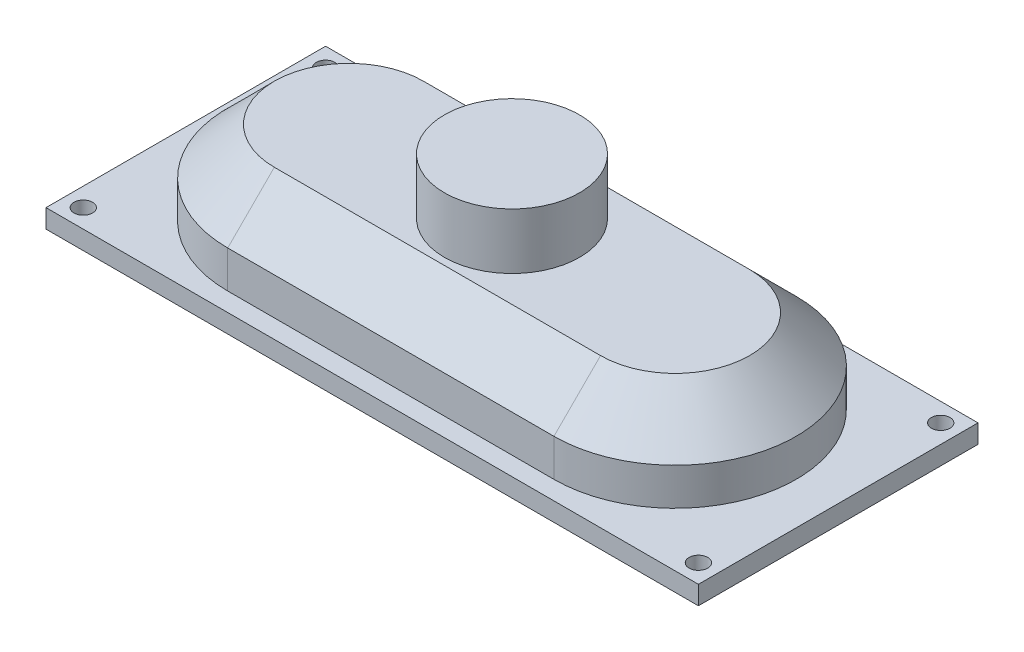
ISO-10303-21;
HEADER;
FILE_DESCRIPTION(('STEP AP214'),'2;1');
FILE_NAME('part.step','',(''),(''),'','','');
FILE_SCHEMA(('AUTOMOTIVE_DESIGN { 1 0 10303 214 1 1 1 1 }'));
ENDSEC;
DATA;
#1=APPLICATION_CONTEXT('core data for automotive mechanical design processes');
#2=APPLICATION_PROTOCOL_DEFINITION('international standard','automotive_design',2000,#1);
#3=PRODUCT_CONTEXT('',#1,'mechanical');
#4=PRODUCT('Part','Part','',(#3));
#5=PRODUCT_RELATED_PRODUCT_CATEGORY('part','',(#4));
#6=PRODUCT_DEFINITION_FORMATION('','',#4);
#7=PRODUCT_DEFINITION_CONTEXT('part definition',#1,'design');
#8=PRODUCT_DEFINITION('design','',#6,#7);
#9=PRODUCT_DEFINITION_SHAPE('','',#8);
#10=(LENGTH_UNIT() NAMED_UNIT(*) SI_UNIT(.MILLI.,.METRE.));
#11=(NAMED_UNIT(*) PLANE_ANGLE_UNIT() SI_UNIT($,.RADIAN.));
#12=(NAMED_UNIT(*) SI_UNIT($,.STERADIAN.) SOLID_ANGLE_UNIT());
#13=UNCERTAINTY_MEASURE_WITH_UNIT(LENGTH_MEASURE(1.E-05),#10,'distance_accuracy_value','');
#14=(GEOMETRIC_REPRESENTATION_CONTEXT(3) GLOBAL_UNCERTAINTY_ASSIGNED_CONTEXT((#13)) GLOBAL_UNIT_ASSIGNED_CONTEXT((#10,
#11,#12)) REPRESENTATION_CONTEXT('',''));
#15=CARTESIAN_POINT('',(0.,0.,0.));
#16=DIRECTION('',(0.,0.,1.));
#17=DIRECTION('',(1.,0.,0.));
#18=AXIS2_PLACEMENT_3D('',#15,#16,#17);
#19=CARTESIAN_POINT('',(0.,2.,0.));
#20=DIRECTION('',(0.,1.,0.));
#21=DIRECTION('',(0.,0.,1.));
#22=AXIS2_PLACEMENT_3D('',#19,#20,#21);
#23=PLANE('',#22);
#24=CARTESIAN_POINT('',(33.,2.,-13.));
#25=DIRECTION('',(0.,1.,0.));
#26=DIRECTION('',(0.,0.,-1.));
#27=AXIS2_PLACEMENT_3D('',#24,#25,#26);
#28=CIRCLE('',#27,0.999999999999998);
#29=CARTESIAN_POINT('',(33.,2.,-14.));
#30=VERTEX_POINT('',#29);
#31=EDGE_CURVE('E334',#30,#30,#28,.T.);
#32=ORIENTED_EDGE('',*,*,#31,.F.);
#33=EDGE_LOOP('',(#32));
#34=FACE_BOUND('',#33,.T.);
#35=CARTESIAN_POINT('',(33.,2.,13.));
#36=DIRECTION('',(0.,1.,0.));
#37=DIRECTION('',(0.,0.,1.));
#38=AXIS2_PLACEMENT_3D('',#35,#36,#37);
#39=CIRCLE('',#38,0.999999999999998);
#40=CARTESIAN_POINT('',(33.,2.,14.));
#41=VERTEX_POINT('',#40);
#42=EDGE_CURVE('E340',#41,#41,#39,.T.);
#43=ORIENTED_EDGE('',*,*,#42,.F.);
#44=EDGE_LOOP('',(#43));
#45=FACE_BOUND('',#44,.T.);
#46=CARTESIAN_POINT('',(-33.,2.,13.));
#47=DIRECTION('',(0.,1.,0.));
#48=DIRECTION('',(0.,0.,-1.));
#49=AXIS2_PLACEMENT_3D('',#46,#47,#48);
#50=CIRCLE('',#49,0.999999999999998);
#51=CARTESIAN_POINT('',(-33.,2.,12.));
#52=VERTEX_POINT('',#51);
#53=EDGE_CURVE('E329',#52,#52,#50,.T.);
#54=ORIENTED_EDGE('',*,*,#53,.F.);
#55=EDGE_LOOP('',(#54));
#56=FACE_BOUND('',#55,.T.);
#57=CARTESIAN_POINT('',(-33.,2.,-13.));
#58=DIRECTION('',(0.,1.,0.));
#59=DIRECTION('',(0.,0.,1.));
#60=AXIS2_PLACEMENT_3D('',#57,#58,#59);
#61=CIRCLE('',#60,0.999999999999998);
#62=CARTESIAN_POINT('',(-33.,2.,-12.));
#63=VERTEX_POINT('',#62);
#64=EDGE_CURVE('E333',#63,#63,#61,.T.);
#65=ORIENTED_EDGE('',*,*,#64,.F.);
#66=EDGE_LOOP('',(#65));
#67=FACE_BOUND('',#66,.T.);
#68=DIRECTION('',(0.,0.,1.));
#69=VECTOR('',#68,1.);
#70=CARTESIAN_POINT('',(-35.,2.,-15.));
#71=LINE('',#70,#69);
#72=CARTESIAN_POINT('',(-35.,2.,-15.));
#73=VERTEX_POINT('',#72);
#74=CARTESIAN_POINT('',(-35.,2.,15.));
#75=VERTEX_POINT('',#74);
#76=EDGE_CURVE('E354',#73,#75,#71,.T.);
#77=ORIENTED_EDGE('',*,*,#76,.T.);
#78=DIRECTION('',(1.,0.,0.));
#79=VECTOR('',#78,1.);
#80=CARTESIAN_POINT('',(-35.,2.,15.));
#81=LINE('',#80,#79);
#82=CARTESIAN_POINT('',(35.,2.,15.));
#83=VERTEX_POINT('',#82);
#84=EDGE_CURVE('E357',#75,#83,#81,.T.);
#85=ORIENTED_EDGE('',*,*,#84,.T.);
#86=DIRECTION('',(0.,0.,-1.));
#87=VECTOR('',#86,1.);
#88=CARTESIAN_POINT('',(35.,2.,-15.));
#89=LINE('',#88,#87);
#90=CARTESIAN_POINT('',(35.,2.,-15.));
#91=VERTEX_POINT('',#90);
#92=EDGE_CURVE('E360',#83,#91,#89,.T.);
#93=ORIENTED_EDGE('',*,*,#92,.T.);
#94=DIRECTION('',(-1.,0.,0.));
#95=VECTOR('',#94,1.);
#96=CARTESIAN_POINT('',(-35.,2.,-15.));
#97=LINE('',#96,#95);
#98=EDGE_CURVE('E362',#91,#73,#97,.T.);
#99=ORIENTED_EDGE('',*,*,#98,.T.);
#100=EDGE_LOOP('',(#77,#85,#93,#99));
#101=FACE_BOUND('',#100,.T.);
#102=DIRECTION('',(1.,0.,0.));
#103=VECTOR('',#102,1.);
#104=CARTESIAN_POINT('',(-17.5,2.,13.));
#105=LINE('',#104,#103);
#106=CARTESIAN_POINT('',(-17.5,2.,13.));
#107=VERTEX_POINT('',#106);
#108=CARTESIAN_POINT('',(17.5,2.,13.));
#109=VERTEX_POINT('',#108);
#110=EDGE_CURVE('E312',#107,#109,#105,.T.);
#111=ORIENTED_EDGE('',*,*,#110,.F.);
#112=CARTESIAN_POINT('',(-17.5,2.,0.));
#113=DIRECTION('',(0.,1.,0.));
#114=DIRECTION('',(0.,0.,1.));
#115=AXIS2_PLACEMENT_3D('',#112,#113,#114);
#116=CIRCLE('',#115,13.);
#117=CARTESIAN_POINT('',(-17.5,2.,-13.));
#118=VERTEX_POINT('',#117);
#119=EDGE_CURVE('E309',#118,#107,#116,.T.);
#120=ORIENTED_EDGE('',*,*,#119,.F.);
#121=DIRECTION('',(-1.,0.,0.));
#122=VECTOR('',#121,1.);
#123=CARTESIAN_POINT('',(-17.5,2.,-13.));
#124=LINE('',#123,#122);
#125=CARTESIAN_POINT('',(17.5,2.,-13.));
#126=VERTEX_POINT('',#125);
#127=EDGE_CURVE('E318',#126,#118,#124,.T.);
#128=ORIENTED_EDGE('',*,*,#127,.F.);
#129=CARTESIAN_POINT('',(17.5,2.,0.));
#130=DIRECTION('',(0.,1.,0.));
#131=DIRECTION('',(0.,0.,1.));
#132=AXIS2_PLACEMENT_3D('',#129,#130,#131);
#133=CIRCLE('',#132,13.);
#134=EDGE_CURVE('E315',#109,#126,#133,.T.);
#135=ORIENTED_EDGE('',*,*,#134,.F.);
#136=EDGE_LOOP('',(#111,#120,#128,#135));
#137=FACE_BOUND('',#136,.T.);
#138=ADVANCED_FACE('F37',(#34,#45,#56,#67,#101,#137),#23,.T.);
#139=CARTESIAN_POINT('',(-35.,2.,-15.));
#140=DIRECTION('',(1.,0.,0.));
#141=DIRECTION('',(0.,0.,-1.));
#142=AXIS2_PLACEMENT_3D('',#139,#140,#141);
#143=PLANE('',#142);
#144=DIRECTION('',(0.,0.,1.));
#145=VECTOR('',#144,1.);
#146=CARTESIAN_POINT('',(-35.,0.,-15.));
#147=LINE('',#146,#145);
#148=CARTESIAN_POINT('',(-35.,0.,-15.));
#149=VERTEX_POINT('',#148);
#150=CARTESIAN_POINT('',(-35.,0.,15.));
#151=VERTEX_POINT('',#150);
#152=EDGE_CURVE('E351',#149,#151,#147,.T.);
#153=ORIENTED_EDGE('',*,*,#152,.T.);
#154=DIRECTION('',(0.,-1.,0.));
#155=VECTOR('',#154,1.);
#156=CARTESIAN_POINT('',(-35.,2.,15.));
#157=LINE('',#156,#155);
#158=EDGE_CURVE('E380',#75,#151,#157,.T.);
#159=ORIENTED_EDGE('',*,*,#158,.F.);
#160=ORIENTED_EDGE('',*,*,#76,.F.);
#161=DIRECTION('',(0.,-1.,0.));
#162=VECTOR('',#161,1.);
#163=CARTESIAN_POINT('',(-35.,2.,-15.));
#164=LINE('',#163,#162);
#165=EDGE_CURVE('E364',#73,#149,#164,.T.);
#166=ORIENTED_EDGE('',*,*,#165,.T.);
#167=EDGE_LOOP('',(#153,#159,#160,#166));
#168=FACE_BOUND('',#167,.T.);
#169=ADVANCED_FACE('F448',(#168),#143,.F.);
#170=CARTESIAN_POINT('',(-35.,2.,15.));
#171=DIRECTION('',(0.,0.,-1.));
#172=DIRECTION('',(-1.,0.,0.));
#173=AXIS2_PLACEMENT_3D('',#170,#171,#172);
#174=PLANE('',#173);
#175=DIRECTION('',(1.,0.,0.));
#176=VECTOR('',#175,1.);
#177=CARTESIAN_POINT('',(-35.,0.,15.));
#178=LINE('',#177,#176);
#179=CARTESIAN_POINT('',(35.,0.,15.));
#180=VERTEX_POINT('',#179);
#181=EDGE_CURVE('E367',#151,#180,#178,.T.);
#182=ORIENTED_EDGE('',*,*,#181,.T.);
#183=DIRECTION('',(0.,-1.,0.));
#184=VECTOR('',#183,1.);
#185=CARTESIAN_POINT('',(35.,2.,15.));
#186=LINE('',#185,#184);
#187=EDGE_CURVE('E377',#83,#180,#186,.T.);
#188=ORIENTED_EDGE('',*,*,#187,.F.);
#189=ORIENTED_EDGE('',*,*,#84,.F.);
#190=ORIENTED_EDGE('',*,*,#158,.T.);
#191=EDGE_LOOP('',(#182,#188,#189,#190));
#192=FACE_BOUND('',#191,.T.);
#193=ADVANCED_FACE('F454',(#192),#174,.F.);
#194=CARTESIAN_POINT('',(35.,2.,-15.));
#195=DIRECTION('',(-1.,0.,0.));
#196=DIRECTION('',(0.,0.,1.));
#197=AXIS2_PLACEMENT_3D('',#194,#195,#196);
#198=PLANE('',#197);
#199=DIRECTION('',(0.,0.,-1.));
#200=VECTOR('',#199,1.);
#201=CARTESIAN_POINT('',(35.,0.,-15.));
#202=LINE('',#201,#200);
#203=CARTESIAN_POINT('',(35.,0.,-15.));
#204=VERTEX_POINT('',#203);
#205=EDGE_CURVE('E369',#180,#204,#202,.T.);
#206=ORIENTED_EDGE('',*,*,#205,.T.);
#207=DIRECTION('',(0.,-1.,0.));
#208=VECTOR('',#207,1.);
#209=CARTESIAN_POINT('',(35.,2.,-15.));
#210=LINE('',#209,#208);
#211=EDGE_CURVE('E374',#91,#204,#210,.T.);
#212=ORIENTED_EDGE('',*,*,#211,.F.);
#213=ORIENTED_EDGE('',*,*,#92,.F.);
#214=ORIENTED_EDGE('',*,*,#187,.T.);
#215=EDGE_LOOP('',(#206,#212,#213,#214));
#216=FACE_BOUND('',#215,.T.);
#217=ADVANCED_FACE('F470',(#216),#198,.F.);
#218=CARTESIAN_POINT('',(-35.,2.,-15.));
#219=DIRECTION('',(0.,0.,1.));
#220=DIRECTION('',(1.,0.,0.));
#221=AXIS2_PLACEMENT_3D('',#218,#219,#220);
#222=PLANE('',#221);
#223=DIRECTION('',(-1.,0.,0.));
#224=VECTOR('',#223,1.);
#225=CARTESIAN_POINT('',(-35.,0.,-15.));
#226=LINE('',#225,#224);
#227=EDGE_CURVE('E358',#204,#149,#226,.T.);
#228=ORIENTED_EDGE('',*,*,#227,.T.);
#229=ORIENTED_EDGE('',*,*,#165,.F.);
#230=ORIENTED_EDGE('',*,*,#98,.F.);
#231=ORIENTED_EDGE('',*,*,#211,.T.);
#232=EDGE_LOOP('',(#228,#229,#230,#231));
#233=FACE_BOUND('',#232,.T.);
#234=ADVANCED_FACE('F466',(#233),#222,.F.);
#235=CARTESIAN_POINT('',(0.,0.,0.));
#236=DIRECTION('',(0.,1.,0.));
#237=DIRECTION('',(0.,0.,1.));
#238=AXIS2_PLACEMENT_3D('',#235,#236,#237);
#239=PLANE('',#238);
#240=CARTESIAN_POINT('',(-33.,0.,-13.));
#241=DIRECTION('',(0.,1.,0.));
#242=DIRECTION('',(0.,0.,1.));
#243=AXIS2_PLACEMENT_3D('',#240,#241,#242);
#244=CIRCLE('',#243,2.);
#245=CARTESIAN_POINT('',(-34.,0.,-11.2679491924311));
#246=VERTEX_POINT('',#245);
#247=CARTESIAN_POINT('',(-31.2679491924311,0.,-14.));
#248=VERTEX_POINT('',#247);
#249=EDGE_CURVE('E270',#246,#248,#244,.T.);
#250=ORIENTED_EDGE('',*,*,#249,.F.);
#251=DIRECTION('',(0.,0.,1.));
#252=VECTOR('',#251,1.);
#253=CARTESIAN_POINT('',(-34.,0.,-15.));
#254=LINE('',#253,#252);
#255=CARTESIAN_POINT('',(-34.,0.,11.2679491924311));
#256=VERTEX_POINT('',#255);
#257=EDGE_CURVE('E267',#246,#256,#254,.T.);
#258=ORIENTED_EDGE('',*,*,#257,.T.);
#259=CARTESIAN_POINT('',(-33.,0.,13.));
#260=DIRECTION('',(0.,1.,0.));
#261=DIRECTION('',(0.,0.,1.));
#262=AXIS2_PLACEMENT_3D('',#259,#260,#261);
#263=CIRCLE('',#262,2.);
#264=CARTESIAN_POINT('',(-31.2679491924311,0.,14.));
#265=VERTEX_POINT('',#264);
#266=EDGE_CURVE('E282',#265,#256,#263,.T.);
#267=ORIENTED_EDGE('',*,*,#266,.F.);
#268=DIRECTION('',(1.,0.,0.));
#269=VECTOR('',#268,1.);
#270=CARTESIAN_POINT('',(-35.,0.,14.));
#271=LINE('',#270,#269);
#272=CARTESIAN_POINT('',(31.2679491924311,0.,14.));
#273=VERTEX_POINT('',#272);
#274=EDGE_CURVE('E54',#265,#273,#271,.T.);
#275=ORIENTED_EDGE('',*,*,#274,.T.);
#276=CARTESIAN_POINT('',(33.,0.,13.));
#277=DIRECTION('',(0.,1.,0.));
#278=DIRECTION('',(0.,0.,1.));
#279=AXIS2_PLACEMENT_3D('',#276,#277,#278);
#280=CIRCLE('',#279,2.);
#281=CARTESIAN_POINT('',(34.,0.,11.2679491924311));
#282=VERTEX_POINT('',#281);
#283=EDGE_CURVE('E286',#282,#273,#280,.T.);
#284=ORIENTED_EDGE('',*,*,#283,.F.);
#285=DIRECTION('',(0.,0.,-1.));
#286=VECTOR('',#285,1.);
#287=CARTESIAN_POINT('',(34.,0.,-15.));
#288=LINE('',#287,#286);
#289=CARTESIAN_POINT('',(34.,0.,-11.2679491924311));
#290=VERTEX_POINT('',#289);
#291=EDGE_CURVE('E275',#282,#290,#288,.T.);
#292=ORIENTED_EDGE('',*,*,#291,.T.);
#293=CARTESIAN_POINT('',(33.,0.,-13.));
#294=DIRECTION('',(0.,1.,0.));
#295=DIRECTION('',(0.,0.,1.));
#296=AXIS2_PLACEMENT_3D('',#293,#294,#295);
#297=CIRCLE('',#296,2.);
#298=CARTESIAN_POINT('',(31.2679491924311,0.,-14.));
#299=VERTEX_POINT('',#298);
#300=EDGE_CURVE('E290',#299,#290,#297,.T.);
#301=ORIENTED_EDGE('',*,*,#300,.F.);
#302=DIRECTION('',(-1.,0.,0.));
#303=VECTOR('',#302,1.);
#304=CARTESIAN_POINT('',(-35.,0.,-14.));
#305=LINE('',#304,#303);
#306=EDGE_CURVE('E271',#299,#248,#305,.T.);
#307=ORIENTED_EDGE('',*,*,#306,.T.);
#308=EDGE_LOOP('',(#250,#258,#267,#275,#284,#292,#301,#307));
#309=FACE_BOUND('',#308,.T.);
#310=CARTESIAN_POINT('',(33.,0.,-13.));
#311=DIRECTION('',(0.,1.,0.));
#312=DIRECTION('',(0.,0.,-1.));
#313=AXIS2_PLACEMENT_3D('',#310,#311,#312);
#314=CIRCLE('',#313,0.999999999999998);
#315=CARTESIAN_POINT('',(33.,0.,-14.));
#316=VERTEX_POINT('',#315);
#317=EDGE_CURVE('E330',#316,#316,#314,.T.);
#318=ORIENTED_EDGE('',*,*,#317,.T.);
#319=EDGE_LOOP('',(#318));
#320=FACE_BOUND('',#319,.T.);
#321=CARTESIAN_POINT('',(33.,0.,13.));
#322=DIRECTION('',(0.,1.,0.));
#323=DIRECTION('',(0.,0.,1.));
#324=AXIS2_PLACEMENT_3D('',#321,#322,#323);
#325=CIRCLE('',#324,0.999999999999998);
#326=CARTESIAN_POINT('',(33.,0.,14.));
#327=VERTEX_POINT('',#326);
#328=EDGE_CURVE('E337',#327,#327,#325,.T.);
#329=ORIENTED_EDGE('',*,*,#328,.T.);
#330=EDGE_LOOP('',(#329));
#331=FACE_BOUND('',#330,.T.);
#332=CARTESIAN_POINT('',(-33.,0.,13.));
#333=DIRECTION('',(0.,1.,0.));
#334=DIRECTION('',(0.,0.,-1.));
#335=AXIS2_PLACEMENT_3D('',#332,#333,#334);
#336=CIRCLE('',#335,0.999999999999998);
#337=CARTESIAN_POINT('',(-33.,0.,12.));
#338=VERTEX_POINT('',#337);
#339=EDGE_CURVE('E343',#338,#338,#336,.T.);
#340=ORIENTED_EDGE('',*,*,#339,.T.);
#341=EDGE_LOOP('',(#340));
#342=FACE_BOUND('',#341,.T.);
#343=CARTESIAN_POINT('',(-33.,0.,-13.));
#344=DIRECTION('',(0.,1.,0.));
#345=DIRECTION('',(0.,0.,1.));
#346=AXIS2_PLACEMENT_3D('',#343,#344,#345);
#347=CIRCLE('',#346,0.999999999999998);
#348=CARTESIAN_POINT('',(-33.,0.,-12.));
#349=VERTEX_POINT('',#348);
#350=EDGE_CURVE('E348',#349,#349,#347,.T.);
#351=ORIENTED_EDGE('',*,*,#350,.T.);
#352=EDGE_LOOP('',(#351));
#353=FACE_BOUND('',#352,.T.);
#354=ORIENTED_EDGE('',*,*,#152,.F.);
#355=ORIENTED_EDGE('',*,*,#227,.F.);
#356=ORIENTED_EDGE('',*,*,#205,.F.);
#357=ORIENTED_EDGE('',*,*,#181,.F.);
#358=EDGE_LOOP('',(#354,#355,#356,#357));
#359=FACE_BOUND('',#358,.T.);
#360=ADVANCED_FACE('F463',(#309,#320,#331,#342,#353,#359),#239,.F.);
#361=CARTESIAN_POINT('',(-33.,0.,-13.));
#362=DIRECTION('',(0.,1.,0.));
#363=DIRECTION('',(0.,0.,1.));
#364=AXIS2_PLACEMENT_3D('',#361,#362,#363);
#365=CYLINDRICAL_SURFACE('',#364,0.999999999999998);
#366=ORIENTED_EDGE('',*,*,#350,.F.);
#367=EDGE_LOOP('',(#366));
#368=FACE_BOUND('',#367,.T.);
#369=ORIENTED_EDGE('',*,*,#64,.T.);
#370=EDGE_LOOP('',(#369));
#371=FACE_BOUND('',#370,.T.);
#372=ADVANCED_FACE('F461',(#368,#371),#365,.F.);
#373=CARTESIAN_POINT('',(-33.,0.,13.));
#374=DIRECTION('',(0.,1.,0.));
#375=DIRECTION('',(0.,0.,1.));
#376=AXIS2_PLACEMENT_3D('',#373,#374,#375);
#377=CYLINDRICAL_SURFACE('',#376,0.999999999999998);
#378=ORIENTED_EDGE('',*,*,#339,.F.);
#379=EDGE_LOOP('',(#378));
#380=FACE_BOUND('',#379,.T.);
#381=ORIENTED_EDGE('',*,*,#53,.T.);
#382=EDGE_LOOP('',(#381));
#383=FACE_BOUND('',#382,.T.);
#384=ADVANCED_FACE('F750',(#380,#383),#377,.F.);
#385=CARTESIAN_POINT('',(33.,0.,13.));
#386=DIRECTION('',(0.,1.,0.));
#387=DIRECTION('',(0.,0.,1.));
#388=AXIS2_PLACEMENT_3D('',#385,#386,#387);
#389=CYLINDRICAL_SURFACE('',#388,0.999999999999998);
#390=ORIENTED_EDGE('',*,*,#328,.F.);
#391=EDGE_LOOP('',(#390));
#392=FACE_BOUND('',#391,.T.);
#393=ORIENTED_EDGE('',*,*,#42,.T.);
#394=EDGE_LOOP('',(#393));
#395=FACE_BOUND('',#394,.T.);
#396=ADVANCED_FACE('F741',(#392,#395),#389,.F.);
#397=CARTESIAN_POINT('',(33.,0.,-13.));
#398=DIRECTION('',(0.,1.,0.));
#399=DIRECTION('',(0.,0.,1.));
#400=AXIS2_PLACEMENT_3D('',#397,#398,#399);
#401=CYLINDRICAL_SURFACE('',#400,0.999999999999998);
#402=ORIENTED_EDGE('',*,*,#317,.F.);
#403=EDGE_LOOP('',(#402));
#404=FACE_BOUND('',#403,.T.);
#405=ORIENTED_EDGE('',*,*,#31,.T.);
#406=EDGE_LOOP('',(#405));
#407=FACE_BOUND('',#406,.T.);
#408=ADVANCED_FACE('F729',(#404,#407),#401,.F.);
#409=CARTESIAN_POINT('',(-17.5,11.,0.));
#410=DIRECTION('',(0.,-1.,0.));
#411=DIRECTION('',(0.,0.,-1.));
#412=AXIS2_PLACEMENT_3D('',#409,#410,#411);
#413=CYLINDRICAL_SURFACE('',#412,13.);
#414=DIRECTION('',(0.,-1.,0.));
#415=VECTOR('',#414,1.);
#416=CARTESIAN_POINT('',(-17.5,11.,13.));
#417=LINE('',#416,#415);
#418=CARTESIAN_POINT('',(-17.5,5.99999999999999,13.));
#419=VERTEX_POINT('',#418);
#420=EDGE_CURVE('E327',#419,#107,#417,.T.);
#421=ORIENTED_EDGE('',*,*,#420,.F.);
#422=CARTESIAN_POINT('',(-17.5,5.99999999999999,0.));
#423=DIRECTION('',(0.,1.,0.));
#424=DIRECTION('',(0.,0.,1.));
#425=AXIS2_PLACEMENT_3D('',#422,#423,#424);
#426=CIRCLE('',#425,13.);
#427=CARTESIAN_POINT('',(-17.5,5.99999999999999,-13.));
#428=VERTEX_POINT('',#427);
#429=EDGE_CURVE('E392',#419,#428,#426,.F.);
#430=ORIENTED_EDGE('',*,*,#429,.T.);
#431=DIRECTION('',(0.,-1.,0.));
#432=VECTOR('',#431,1.);
#433=CARTESIAN_POINT('',(-17.5,11.,-13.));
#434=LINE('',#433,#432);
#435=EDGE_CURVE('E321',#428,#118,#434,.T.);
#436=ORIENTED_EDGE('',*,*,#435,.T.);
#437=ORIENTED_EDGE('',*,*,#119,.T.);
#438=EDGE_LOOP('',(#421,#430,#436,#437));
#439=FACE_BOUND('',#438,.T.);
#440=ADVANCED_FACE('F428',(#439),#413,.T.);
#441=CARTESIAN_POINT('',(-17.5,11.,13.));
#442=DIRECTION('',(0.,0.,-1.));
#443=DIRECTION('',(-1.,0.,0.));
#444=AXIS2_PLACEMENT_3D('',#441,#442,#443);
#445=PLANE('',#444);
#446=DIRECTION('',(0.,-1.,0.));
#447=VECTOR('',#446,1.);
#448=CARTESIAN_POINT('',(17.5,11.,13.));
#449=LINE('',#448,#447);
#450=CARTESIAN_POINT('',(17.5,5.99999999999999,13.));
#451=VERTEX_POINT('',#450);
#452=EDGE_CURVE('E325',#451,#109,#449,.T.);
#453=ORIENTED_EDGE('',*,*,#452,.F.);
#454=DIRECTION('',(-1.,0.,0.));
#455=VECTOR('',#454,1.);
#456=CARTESIAN_POINT('',(-17.5,5.99999999999999,13.));
#457=LINE('',#456,#455);
#458=EDGE_CURVE('E395',#451,#419,#457,.T.);
#459=ORIENTED_EDGE('',*,*,#458,.T.);
#460=ORIENTED_EDGE('',*,*,#420,.T.);
#461=ORIENTED_EDGE('',*,*,#110,.T.);
#462=EDGE_LOOP('',(#453,#459,#460,#461));
#463=FACE_BOUND('',#462,.T.);
#464=ADVANCED_FACE('F419',(#463),#445,.F.);
#465=CARTESIAN_POINT('',(17.5,11.,0.));
#466=DIRECTION('',(0.,-1.,0.));
#467=DIRECTION('',(0.,0.,-1.));
#468=AXIS2_PLACEMENT_3D('',#465,#466,#467);
#469=CYLINDRICAL_SURFACE('',#468,13.);
#470=DIRECTION('',(0.,-1.,0.));
#471=VECTOR('',#470,1.);
#472=CARTESIAN_POINT('',(17.5,11.,-13.));
#473=LINE('',#472,#471);
#474=CARTESIAN_POINT('',(17.5,5.99999999999999,-13.));
#475=VERTEX_POINT('',#474);
#476=EDGE_CURVE('E323',#475,#126,#473,.T.);
#477=ORIENTED_EDGE('',*,*,#476,.F.);
#478=CARTESIAN_POINT('',(17.5,5.99999999999999,0.));
#479=DIRECTION('',(0.,1.,0.));
#480=DIRECTION('',(0.,0.,1.));
#481=AXIS2_PLACEMENT_3D('',#478,#479,#480);
#482=CIRCLE('',#481,13.);
#483=EDGE_CURVE('E46',#475,#451,#482,.F.);
#484=ORIENTED_EDGE('',*,*,#483,.T.);
#485=ORIENTED_EDGE('',*,*,#452,.T.);
#486=ORIENTED_EDGE('',*,*,#134,.T.);
#487=EDGE_LOOP('',(#477,#484,#485,#486));
#488=FACE_BOUND('',#487,.T.);
#489=ADVANCED_FACE('F417',(#488),#469,.T.);
#490=CARTESIAN_POINT('',(-17.5,11.,-13.));
#491=DIRECTION('',(0.,0.,1.));
#492=DIRECTION('',(1.,0.,0.));
#493=AXIS2_PLACEMENT_3D('',#490,#491,#492);
#494=PLANE('',#493);
#495=ORIENTED_EDGE('',*,*,#435,.F.);
#496=DIRECTION('',(1.,0.,0.));
#497=VECTOR('',#496,1.);
#498=CARTESIAN_POINT('',(17.5,5.99999999999999,-13.));
#499=LINE('',#498,#497);
#500=EDGE_CURVE('E12',#428,#475,#499,.T.);
#501=ORIENTED_EDGE('',*,*,#500,.T.);
#502=ORIENTED_EDGE('',*,*,#476,.T.);
#503=ORIENTED_EDGE('',*,*,#127,.T.);
#504=EDGE_LOOP('',(#495,#501,#502,#503));
#505=FACE_BOUND('',#504,.T.);
#506=ADVANCED_FACE('F426',(#505),#494,.F.);
#507=CARTESIAN_POINT('',(-17.5,11.,0.));
#508=DIRECTION('',(0.,1.,0.));
#509=DIRECTION('',(0.,0.,1.));
#510=AXIS2_PLACEMENT_3D('',#507,#508,#509);
#511=PLANE('',#510);
#512=CARTESIAN_POINT('',(0.,11.,0.));
#513=DIRECTION('',(0.,1.,0.));
#514=DIRECTION('',(0.,0.,1.));
#515=AXIS2_PLACEMENT_3D('',#512,#513,#514);
#516=CIRCLE('',#515,7.25);
#517=CARTESIAN_POINT('',(0.,11.,7.25));
#518=VERTEX_POINT('',#517);
#519=EDGE_CURVE('E836',#518,#518,#516,.T.);
#520=ORIENTED_EDGE('',*,*,#519,.F.);
#521=EDGE_LOOP('',(#520));
#522=FACE_BOUND('',#521,.T.);
#523=DIRECTION('',(-1.,0.,0.));
#524=VECTOR('',#523,1.);
#525=CARTESIAN_POINT('',(-17.5,11.,-8.00000000000001));
#526=LINE('',#525,#524);
#527=CARTESIAN_POINT('',(17.5,11.,-8.00000000000001));
#528=VERTEX_POINT('',#527);
#529=CARTESIAN_POINT('',(-17.5,11.,-8.00000000000001));
#530=VERTEX_POINT('',#529);
#531=EDGE_CURVE('E383',#528,#530,#526,.T.);
#532=ORIENTED_EDGE('',*,*,#531,.T.);
#533=CARTESIAN_POINT('',(-17.5,11.,0.));
#534=DIRECTION('',(0.,1.,0.));
#535=DIRECTION('',(0.,0.,1.));
#536=AXIS2_PLACEMENT_3D('',#533,#534,#535);
#537=CIRCLE('',#536,8.00000000000001);
#538=CARTESIAN_POINT('',(-17.5,11.,8.00000000000001));
#539=VERTEX_POINT('',#538);
#540=EDGE_CURVE('E389',#530,#539,#537,.T.);
#541=ORIENTED_EDGE('',*,*,#540,.T.);
#542=DIRECTION('',(1.,0.,0.));
#543=VECTOR('',#542,1.);
#544=CARTESIAN_POINT('',(17.5,11.,8.00000000000001));
#545=LINE('',#544,#543);
#546=CARTESIAN_POINT('',(17.5,11.,8.00000000000001));
#547=VERTEX_POINT('',#546);
#548=EDGE_CURVE('E387',#539,#547,#545,.T.);
#549=ORIENTED_EDGE('',*,*,#548,.T.);
#550=CARTESIAN_POINT('',(17.5,11.,0.));
#551=DIRECTION('',(0.,1.,0.));
#552=DIRECTION('',(0.,0.,1.));
#553=AXIS2_PLACEMENT_3D('',#550,#551,#552);
#554=CIRCLE('',#553,8.00000000000001);
#555=EDGE_CURVE('E385',#547,#528,#554,.T.);
#556=ORIENTED_EDGE('',*,*,#555,.T.);
#557=EDGE_LOOP('',(#532,#541,#549,#556));
#558=FACE_BOUND('',#557,.T.);
#559=ADVANCED_FACE('F436',(#522,#558),#511,.T.);
#560=CARTESIAN_POINT('',(17.5,11.,0.));
#561=DIRECTION('',(0.,-1.,0.));
#562=DIRECTION('',(0.,0.,-1.));
#563=AXIS2_PLACEMENT_3D('',#560,#561,#562);
#564=CONICAL_SURFACE('',#563,8.00000000000001,0.785398163397446);
#565=DIRECTION('',(0.,0.707106781186549,-0.707106781186546));
#566=VECTOR('',#565,1.);
#567=CARTESIAN_POINT('',(17.5,5.99999999999999,13.));
#568=LINE('',#567,#566);
#569=EDGE_CURVE('E400',#451,#547,#568,.T.);
#570=ORIENTED_EDGE('',*,*,#569,.F.);
#571=ORIENTED_EDGE('',*,*,#483,.F.);
#572=DIRECTION('',(0.,-0.707106781186549,-0.707106781186546));
#573=VECTOR('',#572,1.);
#574=CARTESIAN_POINT('',(17.5,11.,-8.00000000000001));
#575=LINE('',#574,#573);
#576=EDGE_CURVE('E41',#528,#475,#575,.T.);
#577=ORIENTED_EDGE('',*,*,#576,.F.);
#578=ORIENTED_EDGE('',*,*,#555,.F.);
#579=EDGE_LOOP('',(#570,#571,#577,#578));
#580=FACE_BOUND('',#579,.T.);
#581=ADVANCED_FACE('F39',(#580),#564,.T.);
#582=CARTESIAN_POINT('',(-17.5,11.,-8.00000000000001));
#583=DIRECTION('',(0.,0.707106781186546,-0.707106781186549));
#584=DIRECTION('',(1.,0.,0.));
#585=AXIS2_PLACEMENT_3D('',#582,#583,#584);
#586=PLANE('',#585);
#587=ORIENTED_EDGE('',*,*,#576,.T.);
#588=ORIENTED_EDGE('',*,*,#500,.F.);
#589=DIRECTION('',(0.,-0.707106781186549,-0.707106781186546));
#590=VECTOR('',#589,1.);
#591=CARTESIAN_POINT('',(-17.5,11.,-8.00000000000001));
#592=LINE('',#591,#590);
#593=EDGE_CURVE('E399',#530,#428,#592,.T.);
#594=ORIENTED_EDGE('',*,*,#593,.F.);
#595=ORIENTED_EDGE('',*,*,#531,.F.);
#596=EDGE_LOOP('',(#587,#588,#594,#595));
#597=FACE_BOUND('',#596,.T.);
#598=ADVANCED_FACE('F410',(#597),#586,.T.);
#599=CARTESIAN_POINT('',(-17.5,11.,8.00000000000001));
#600=DIRECTION('',(0.,0.707106781186546,0.707106781186549));
#601=DIRECTION('',(-1.,0.,0.));
#602=AXIS2_PLACEMENT_3D('',#599,#600,#601);
#603=PLANE('',#602);
#604=ORIENTED_EDGE('',*,*,#569,.T.);
#605=ORIENTED_EDGE('',*,*,#548,.F.);
#606=DIRECTION('',(0.,0.707106781186549,-0.707106781186546));
#607=VECTOR('',#606,1.);
#608=CARTESIAN_POINT('',(-17.5,5.99999999999999,13.));
#609=LINE('',#608,#607);
#610=EDGE_CURVE('E308',#419,#539,#609,.T.);
#611=ORIENTED_EDGE('',*,*,#610,.F.);
#612=ORIENTED_EDGE('',*,*,#458,.F.);
#613=EDGE_LOOP('',(#604,#605,#611,#612));
#614=FACE_BOUND('',#613,.T.);
#615=ADVANCED_FACE('F434',(#614),#603,.T.);
#616=CARTESIAN_POINT('',(-17.5,11.,0.));
#617=DIRECTION('',(0.,-1.,0.));
#618=DIRECTION('',(0.,0.,-1.));
#619=AXIS2_PLACEMENT_3D('',#616,#617,#618);
#620=CONICAL_SURFACE('',#619,8.00000000000001,0.785398163397446);
#621=ORIENTED_EDGE('',*,*,#593,.T.);
#622=ORIENTED_EDGE('',*,*,#429,.F.);
#623=ORIENTED_EDGE('',*,*,#610,.T.);
#624=ORIENTED_EDGE('',*,*,#540,.F.);
#625=EDGE_LOOP('',(#621,#622,#623,#624));
#626=FACE_BOUND('',#625,.T.);
#627=ADVANCED_FACE('F432',(#626),#620,.T.);
#628=CARTESIAN_POINT('',(0.,1.,0.));
#629=DIRECTION('',(0.,1.,0.));
#630=DIRECTION('',(0.,0.,1.));
#631=AXIS2_PLACEMENT_3D('',#628,#629,#630);
#632=PLANE('',#631);
#633=CARTESIAN_POINT('',(-33.,1.,-13.));
#634=DIRECTION('',(0.,1.,0.));
#635=DIRECTION('',(0.,0.,1.));
#636=AXIS2_PLACEMENT_3D('',#633,#634,#635);
#637=CIRCLE('',#636,2.);
#638=CARTESIAN_POINT('',(-34.,1.,-11.2679491924311));
#639=VERTEX_POINT('',#638);
#640=CARTESIAN_POINT('',(-31.2679491924311,1.,-14.));
#641=VERTEX_POINT('',#640);
#642=EDGE_CURVE('E281',#639,#641,#637,.T.);
#643=ORIENTED_EDGE('',*,*,#642,.T.);
#644=DIRECTION('',(-1.,0.,0.));
#645=VECTOR('',#644,1.);
#646=CARTESIAN_POINT('',(-35.,1.,-14.));
#647=LINE('',#646,#645);
#648=CARTESIAN_POINT('',(31.2679491924311,1.,-14.));
#649=VERTEX_POINT('',#648);
#650=EDGE_CURVE('E231',#649,#641,#647,.T.);
#651=ORIENTED_EDGE('',*,*,#650,.F.);
#652=CARTESIAN_POINT('',(33.,1.,-13.));
#653=DIRECTION('',(0.,1.,0.));
#654=DIRECTION('',(0.,0.,1.));
#655=AXIS2_PLACEMENT_3D('',#652,#653,#654);
#656=CIRCLE('',#655,2.);
#657=CARTESIAN_POINT('',(34.,1.,-11.2679491924311));
#658=VERTEX_POINT('',#657);
#659=EDGE_CURVE('E289',#649,#658,#656,.T.);
#660=ORIENTED_EDGE('',*,*,#659,.T.);
#661=DIRECTION('',(0.,0.,-1.));
#662=VECTOR('',#661,1.);
#663=CARTESIAN_POINT('',(34.,1.,-15.));
#664=LINE('',#663,#662);
#665=CARTESIAN_POINT('',(34.,1.,11.2679491924311));
#666=VERTEX_POINT('',#665);
#667=EDGE_CURVE('E853',#666,#658,#664,.T.);
#668=ORIENTED_EDGE('',*,*,#667,.F.);
#669=CARTESIAN_POINT('',(33.,1.,13.));
#670=DIRECTION('',(0.,1.,0.));
#671=DIRECTION('',(0.,0.,1.));
#672=AXIS2_PLACEMENT_3D('',#669,#670,#671);
#673=CIRCLE('',#672,2.);
#674=CARTESIAN_POINT('',(31.2679491924311,1.,14.));
#675=VERTEX_POINT('',#674);
#676=EDGE_CURVE('E285',#666,#675,#673,.T.);
#677=ORIENTED_EDGE('',*,*,#676,.T.);
#678=DIRECTION('',(1.,0.,0.));
#679=VECTOR('',#678,1.);
#680=CARTESIAN_POINT('',(-35.,1.,14.));
#681=LINE('',#680,#679);
#682=CARTESIAN_POINT('',(-31.2679491924311,1.,14.));
#683=VERTEX_POINT('',#682);
#684=EDGE_CURVE('E851',#683,#675,#681,.T.);
#685=ORIENTED_EDGE('',*,*,#684,.F.);
#686=CARTESIAN_POINT('',(-33.,1.,13.));
#687=DIRECTION('',(0.,1.,0.));
#688=DIRECTION('',(0.,0.,1.));
#689=AXIS2_PLACEMENT_3D('',#686,#687,#688);
#690=CIRCLE('',#689,2.);
#691=CARTESIAN_POINT('',(-34.,1.,11.2679491924311));
#692=VERTEX_POINT('',#691);
#693=EDGE_CURVE('E211',#683,#692,#690,.T.);
#694=ORIENTED_EDGE('',*,*,#693,.T.);
#695=DIRECTION('',(0.,0.,1.));
#696=VECTOR('',#695,1.);
#697=CARTESIAN_POINT('',(-34.,1.,-15.));
#698=LINE('',#697,#696);
#699=EDGE_CURVE('E274',#639,#692,#698,.T.);
#700=ORIENTED_EDGE('',*,*,#699,.F.);
#701=EDGE_LOOP('',(#643,#651,#660,#668,#677,#685,#694,#700));
#702=FACE_BOUND('',#701,.T.);
#703=DIRECTION('',(1.,0.,0.));
#704=VECTOR('',#703,1.);
#705=CARTESIAN_POINT('',(-17.5,1.,12.));
#706=LINE('',#705,#704);
#707=CARTESIAN_POINT('',(-17.5,1.,12.));
#708=VERTEX_POINT('',#707);
#709=CARTESIAN_POINT('',(17.5,1.,12.));
#710=VERTEX_POINT('',#709);
#711=EDGE_CURVE('E219',#708,#710,#706,.T.);
#712=ORIENTED_EDGE('',*,*,#711,.T.);
#713=CARTESIAN_POINT('',(17.5,1.,0.));
#714=DIRECTION('',(0.,1.,0.));
#715=DIRECTION('',(0.,0.,1.));
#716=AXIS2_PLACEMENT_3D('',#713,#714,#715);
#717=CIRCLE('',#716,12.);
#718=CARTESIAN_POINT('',(17.5,1.,-12.));
#719=VERTEX_POINT('',#718);
#720=EDGE_CURVE('E227',#710,#719,#717,.T.);
#721=ORIENTED_EDGE('',*,*,#720,.T.);
#722=DIRECTION('',(-1.,0.,0.));
#723=VECTOR('',#722,1.);
#724=CARTESIAN_POINT('',(-17.5,1.,-12.));
#725=LINE('',#724,#723);
#726=CARTESIAN_POINT('',(-17.5,1.,-12.));
#727=VERTEX_POINT('',#726);
#728=EDGE_CURVE('E222',#719,#727,#725,.T.);
#729=ORIENTED_EDGE('',*,*,#728,.T.);
#730=CARTESIAN_POINT('',(-17.5,1.,0.));
#731=DIRECTION('',(0.,1.,0.));
#732=DIRECTION('',(0.,0.,1.));
#733=AXIS2_PLACEMENT_3D('',#730,#731,#732);
#734=CIRCLE('',#733,12.);
#735=EDGE_CURVE('E204',#727,#708,#734,.T.);
#736=ORIENTED_EDGE('',*,*,#735,.T.);
#737=EDGE_LOOP('',(#712,#721,#729,#736));
#738=FACE_BOUND('',#737,.T.);
#739=ADVANCED_FACE('F217',(#702,#738),#632,.F.);
#740=CARTESIAN_POINT('',(-34.,2.,-15.));
#741=DIRECTION('',(1.,0.,0.));
#742=DIRECTION('',(0.,0.,-1.));
#743=AXIS2_PLACEMENT_3D('',#740,#741,#742);
#744=PLANE('',#743);
#745=ORIENTED_EDGE('',*,*,#257,.F.);
#746=DIRECTION('',(0.,1.,0.));
#747=VECTOR('',#746,1.);
#748=CARTESIAN_POINT('',(-34.,0.,-11.2679491924311));
#749=LINE('',#748,#747);
#750=EDGE_CURVE('E248',#246,#639,#749,.T.);
#751=ORIENTED_EDGE('',*,*,#750,.T.);
#752=ORIENTED_EDGE('',*,*,#699,.T.);
#753=DIRECTION('',(0.,1.,0.));
#754=VECTOR('',#753,1.);
#755=CARTESIAN_POINT('',(-34.,0.,11.2679491924311));
#756=LINE('',#755,#754);
#757=EDGE_CURVE('E298',#256,#692,#756,.T.);
#758=ORIENTED_EDGE('',*,*,#757,.F.);
#759=EDGE_LOOP('',(#745,#751,#752,#758));
#760=FACE_BOUND('',#759,.T.);
#761=ADVANCED_FACE('F501',(#760),#744,.T.);
#762=CARTESIAN_POINT('',(-35.,2.,14.));
#763=DIRECTION('',(0.,0.,-1.));
#764=DIRECTION('',(-1.,0.,0.));
#765=AXIS2_PLACEMENT_3D('',#762,#763,#764);
#766=PLANE('',#765);
#767=ORIENTED_EDGE('',*,*,#274,.F.);
#768=DIRECTION('',(0.,1.,0.));
#769=VECTOR('',#768,1.);
#770=CARTESIAN_POINT('',(-31.2679491924311,0.,14.));
#771=LINE('',#770,#769);
#772=EDGE_CURVE('E296',#265,#683,#771,.T.);
#773=ORIENTED_EDGE('',*,*,#772,.T.);
#774=ORIENTED_EDGE('',*,*,#684,.T.);
#775=DIRECTION('',(0.,1.,0.));
#776=VECTOR('',#775,1.);
#777=CARTESIAN_POINT('',(31.2679491924311,0.,14.));
#778=LINE('',#777,#776);
#779=EDGE_CURVE('E302',#273,#675,#778,.T.);
#780=ORIENTED_EDGE('',*,*,#779,.F.);
#781=EDGE_LOOP('',(#767,#773,#774,#780));
#782=FACE_BOUND('',#781,.T.);
#783=ADVANCED_FACE('F509',(#782),#766,.T.);
#784=CARTESIAN_POINT('',(34.,2.,-15.));
#785=DIRECTION('',(-1.,0.,0.));
#786=DIRECTION('',(0.,0.,1.));
#787=AXIS2_PLACEMENT_3D('',#784,#785,#786);
#788=PLANE('',#787);
#789=ORIENTED_EDGE('',*,*,#291,.F.);
#790=DIRECTION('',(0.,1.,0.));
#791=VECTOR('',#790,1.);
#792=CARTESIAN_POINT('',(34.,0.,11.2679491924311));
#793=LINE('',#792,#791);
#794=EDGE_CURVE('E300',#282,#666,#793,.T.);
#795=ORIENTED_EDGE('',*,*,#794,.T.);
#796=ORIENTED_EDGE('',*,*,#667,.T.);
#797=DIRECTION('',(0.,1.,0.));
#798=VECTOR('',#797,1.);
#799=CARTESIAN_POINT('',(34.,0.,-11.2679491924311));
#800=LINE('',#799,#798);
#801=EDGE_CURVE('E306',#290,#658,#800,.T.);
#802=ORIENTED_EDGE('',*,*,#801,.F.);
#803=EDGE_LOOP('',(#789,#795,#796,#802));
#804=FACE_BOUND('',#803,.T.);
#805=ADVANCED_FACE('F517',(#804),#788,.T.);
#806=CARTESIAN_POINT('',(-35.,2.,-14.));
#807=DIRECTION('',(0.,0.,1.));
#808=DIRECTION('',(1.,0.,0.));
#809=AXIS2_PLACEMENT_3D('',#806,#807,#808);
#810=PLANE('',#809);
#811=DIRECTION('',(0.,1.,0.));
#812=VECTOR('',#811,1.);
#813=CARTESIAN_POINT('',(31.2679491924311,0.,-14.));
#814=LINE('',#813,#812);
#815=EDGE_CURVE('E304',#299,#649,#814,.T.);
#816=ORIENTED_EDGE('',*,*,#815,.T.);
#817=ORIENTED_EDGE('',*,*,#650,.T.);
#818=DIRECTION('',(0.,1.,0.));
#819=VECTOR('',#818,1.);
#820=CARTESIAN_POINT('',(-31.2679491924311,0.,-14.));
#821=LINE('',#820,#819);
#822=EDGE_CURVE('E294',#248,#641,#821,.T.);
#823=ORIENTED_EDGE('',*,*,#822,.F.);
#824=ORIENTED_EDGE('',*,*,#306,.F.);
#825=EDGE_LOOP('',(#816,#817,#823,#824));
#826=FACE_BOUND('',#825,.T.);
#827=ADVANCED_FACE('F524',(#826),#810,.T.);
#828=CARTESIAN_POINT('',(-33.,0.,-13.));
#829=DIRECTION('',(0.,1.,0.));
#830=DIRECTION('',(0.,0.,1.));
#831=AXIS2_PLACEMENT_3D('',#828,#829,#830);
#832=CYLINDRICAL_SURFACE('',#831,2.);
#833=ORIENTED_EDGE('',*,*,#822,.T.);
#834=ORIENTED_EDGE('',*,*,#642,.F.);
#835=ORIENTED_EDGE('',*,*,#750,.F.);
#836=ORIENTED_EDGE('',*,*,#249,.T.);
#837=EDGE_LOOP('',(#833,#834,#835,#836));
#838=FACE_BOUND('',#837,.T.);
#839=ADVANCED_FACE('F532',(#838),#832,.T.);
#840=CARTESIAN_POINT('',(-33.,0.,13.));
#841=DIRECTION('',(0.,1.,0.));
#842=DIRECTION('',(0.,0.,1.));
#843=AXIS2_PLACEMENT_3D('',#840,#841,#842);
#844=CYLINDRICAL_SURFACE('',#843,2.);
#845=ORIENTED_EDGE('',*,*,#757,.T.);
#846=ORIENTED_EDGE('',*,*,#693,.F.);
#847=ORIENTED_EDGE('',*,*,#772,.F.);
#848=ORIENTED_EDGE('',*,*,#266,.T.);
#849=EDGE_LOOP('',(#845,#846,#847,#848));
#850=FACE_BOUND('',#849,.T.);
#851=ADVANCED_FACE('F540',(#850),#844,.T.);
#852=CARTESIAN_POINT('',(33.,0.,13.));
#853=DIRECTION('',(0.,1.,0.));
#854=DIRECTION('',(0.,0.,1.));
#855=AXIS2_PLACEMENT_3D('',#852,#853,#854);
#856=CYLINDRICAL_SURFACE('',#855,2.);
#857=ORIENTED_EDGE('',*,*,#779,.T.);
#858=ORIENTED_EDGE('',*,*,#676,.F.);
#859=ORIENTED_EDGE('',*,*,#794,.F.);
#860=ORIENTED_EDGE('',*,*,#283,.T.);
#861=EDGE_LOOP('',(#857,#858,#859,#860));
#862=FACE_BOUND('',#861,.T.);
#863=ADVANCED_FACE('F548',(#862),#856,.T.);
#864=CARTESIAN_POINT('',(33.,0.,-13.));
#865=DIRECTION('',(0.,1.,0.));
#866=DIRECTION('',(0.,0.,1.));
#867=AXIS2_PLACEMENT_3D('',#864,#865,#866);
#868=CYLINDRICAL_SURFACE('',#867,2.);
#869=ORIENTED_EDGE('',*,*,#801,.T.);
#870=ORIENTED_EDGE('',*,*,#659,.F.);
#871=ORIENTED_EDGE('',*,*,#815,.F.);
#872=ORIENTED_EDGE('',*,*,#300,.T.);
#873=EDGE_LOOP('',(#869,#870,#871,#872));
#874=FACE_BOUND('',#873,.T.);
#875=ADVANCED_FACE('F556',(#874),#868,.T.);
#876=CARTESIAN_POINT('',(-17.5,11.,0.));
#877=DIRECTION('',(0.,-1.,0.));
#878=DIRECTION('',(0.,0.,-1.));
#879=AXIS2_PLACEMENT_3D('',#876,#877,#878);
#880=CYLINDRICAL_SURFACE('',#879,12.);
#881=DIRECTION('',(0.,1.,0.));
#882=VECTOR('',#881,1.);
#883=CARTESIAN_POINT('',(-17.5,11.,12.));
#884=LINE('',#883,#882);
#885=CARTESIAN_POINT('',(-17.5,5.58578643762689,12.));
#886=VERTEX_POINT('',#885);
#887=EDGE_CURVE('E200',#886,#708,#884,.F.);
#888=ORIENTED_EDGE('',*,*,#887,.T.);
#889=ORIENTED_EDGE('',*,*,#735,.F.);
#890=DIRECTION('',(0.,-1.,0.));
#891=VECTOR('',#890,1.);
#892=CARTESIAN_POINT('',(-17.5,11.,-12.));
#893=LINE('',#892,#891);
#894=CARTESIAN_POINT('',(-17.5,5.58578643762689,-12.));
#895=VERTEX_POINT('',#894);
#896=EDGE_CURVE('E234',#895,#727,#893,.T.);
#897=ORIENTED_EDGE('',*,*,#896,.F.);
#898=CARTESIAN_POINT('',(-17.5,5.5857864376269,0.));
#899=DIRECTION('',(0.,-1.,0.));
#900=DIRECTION('',(0.,0.,-1.));
#901=AXIS2_PLACEMENT_3D('',#898,#899,#900);
#902=CIRCLE('',#901,12.);
#903=EDGE_CURVE('E206',#886,#895,#902,.T.);
#904=ORIENTED_EDGE('',*,*,#903,.F.);
#905=EDGE_LOOP('',(#888,#889,#897,#904));
#906=FACE_BOUND('',#905,.T.);
#907=ADVANCED_FACE('F202',(#906),#880,.F.);
#908=CARTESIAN_POINT('',(-17.5,11.,12.));
#909=DIRECTION('',(0.,0.,-1.));
#910=DIRECTION('',(-1.,0.,0.));
#911=AXIS2_PLACEMENT_3D('',#908,#909,#910);
#912=PLANE('',#911);
#913=DIRECTION('',(0.,-1.,0.));
#914=VECTOR('',#913,1.);
#915=CARTESIAN_POINT('',(17.5,11.,12.));
#916=LINE('',#915,#914);
#917=CARTESIAN_POINT('',(17.5,5.58578643762689,12.));
#918=VERTEX_POINT('',#917);
#919=EDGE_CURVE('E212',#918,#710,#916,.T.);
#920=ORIENTED_EDGE('',*,*,#919,.T.);
#921=ORIENTED_EDGE('',*,*,#711,.F.);
#922=ORIENTED_EDGE('',*,*,#887,.F.);
#923=DIRECTION('',(-1.,0.,0.));
#924=VECTOR('',#923,1.);
#925=CARTESIAN_POINT('',(-17.5,5.58578643762689,12.));
#926=LINE('',#925,#924);
#927=EDGE_CURVE('E237',#918,#886,#926,.T.);
#928=ORIENTED_EDGE('',*,*,#927,.F.);
#929=EDGE_LOOP('',(#920,#921,#922,#928));
#930=FACE_BOUND('',#929,.T.);
#931=ADVANCED_FACE('F225',(#930),#912,.T.);
#932=CARTESIAN_POINT('',(17.5,11.,0.));
#933=DIRECTION('',(0.,-1.,0.));
#934=DIRECTION('',(0.,0.,-1.));
#935=AXIS2_PLACEMENT_3D('',#932,#933,#934);
#936=CYLINDRICAL_SURFACE('',#935,12.);
#937=DIRECTION('',(0.,1.,0.));
#938=VECTOR('',#937,1.);
#939=CARTESIAN_POINT('',(17.5,11.,-12.));
#940=LINE('',#939,#938);
#941=CARTESIAN_POINT('',(17.5,5.58578643762689,-12.));
#942=VERTEX_POINT('',#941);
#943=EDGE_CURVE('E240',#942,#719,#940,.F.);
#944=ORIENTED_EDGE('',*,*,#943,.T.);
#945=ORIENTED_EDGE('',*,*,#720,.F.);
#946=ORIENTED_EDGE('',*,*,#919,.F.);
#947=CARTESIAN_POINT('',(17.5,5.5857864376269,0.));
#948=DIRECTION('',(0.,-1.,0.));
#949=DIRECTION('',(0.,0.,-1.));
#950=AXIS2_PLACEMENT_3D('',#947,#948,#949);
#951=CIRCLE('',#950,12.);
#952=EDGE_CURVE('E243',#942,#918,#951,.T.);
#953=ORIENTED_EDGE('',*,*,#952,.F.);
#954=EDGE_LOOP('',(#944,#945,#946,#953));
#955=FACE_BOUND('',#954,.T.);
#956=ADVANCED_FACE('F577',(#955),#936,.F.);
#957=CARTESIAN_POINT('',(-17.5,11.,-12.));
#958=DIRECTION('',(0.,0.,1.));
#959=DIRECTION('',(1.,0.,0.));
#960=AXIS2_PLACEMENT_3D('',#957,#958,#959);
#961=PLANE('',#960);
#962=ORIENTED_EDGE('',*,*,#896,.T.);
#963=ORIENTED_EDGE('',*,*,#728,.F.);
#964=ORIENTED_EDGE('',*,*,#943,.F.);
#965=DIRECTION('',(1.,0.,0.));
#966=VECTOR('',#965,1.);
#967=CARTESIAN_POINT('',(-17.5,5.58578643762689,-12.));
#968=LINE('',#967,#966);
#969=EDGE_CURVE('E246',#895,#942,#968,.T.);
#970=ORIENTED_EDGE('',*,*,#969,.F.);
#971=EDGE_LOOP('',(#962,#963,#964,#970));
#972=FACE_BOUND('',#971,.T.);
#973=ADVANCED_FACE('F584',(#972),#961,.T.);
#974=CARTESIAN_POINT('',(-17.5,10.,0.));
#975=DIRECTION('',(0.,1.,0.));
#976=DIRECTION('',(0.,0.,1.));
#977=AXIS2_PLACEMENT_3D('',#974,#975,#976);
#978=PLANE('',#977);
#979=DIRECTION('',(-1.,0.,0.));
#980=VECTOR('',#979,1.);
#981=CARTESIAN_POINT('',(-17.5,10.,-7.58578643762691));
#982=LINE('',#981,#980);
#983=CARTESIAN_POINT('',(17.5,10.,-7.58578643762692));
#984=VERTEX_POINT('',#983);
#985=CARTESIAN_POINT('',(-17.5,10.,-7.58578643762692));
#986=VERTEX_POINT('',#985);
#987=EDGE_CURVE('E258',#984,#986,#982,.T.);
#988=ORIENTED_EDGE('',*,*,#987,.F.);
#989=CARTESIAN_POINT('',(17.5,10.,0.));
#990=DIRECTION('',(0.,1.,0.));
#991=DIRECTION('',(0.,0.,1.));
#992=AXIS2_PLACEMENT_3D('',#989,#990,#991);
#993=CIRCLE('',#992,7.58578643762691);
#994=CARTESIAN_POINT('',(17.5,10.,7.58578643762691));
#995=VERTEX_POINT('',#994);
#996=EDGE_CURVE('E255',#995,#984,#993,.T.);
#997=ORIENTED_EDGE('',*,*,#996,.F.);
#998=DIRECTION('',(1.,0.,0.));
#999=VECTOR('',#998,1.);
#1000=CARTESIAN_POINT('',(-17.5,10.,7.58578643762691));
#1001=LINE('',#1000,#999);
#1002=CARTESIAN_POINT('',(-17.5,10.,7.58578643762692));
#1003=VERTEX_POINT('',#1002);
#1004=EDGE_CURVE('E257',#1003,#995,#1001,.T.);
#1005=ORIENTED_EDGE('',*,*,#1004,.F.);
#1006=CARTESIAN_POINT('',(-17.5,10.,0.));
#1007=DIRECTION('',(0.,1.,0.));
#1008=DIRECTION('',(0.,0.,1.));
#1009=AXIS2_PLACEMENT_3D('',#1006,#1007,#1008);
#1010=CIRCLE('',#1009,7.58578643762691);
#1011=EDGE_CURVE('E238',#986,#1003,#1010,.T.);
#1012=ORIENTED_EDGE('',*,*,#1011,.F.);
#1013=EDGE_LOOP('',(#988,#997,#1005,#1012));
#1014=FACE_BOUND('',#1013,.T.);
#1015=ADVANCED_FACE('F592',(#1014),#978,.F.);
#1016=CARTESIAN_POINT('',(17.5,10.2928932188135,0.));
#1017=DIRECTION('',(0.,-1.,0.));
#1018=DIRECTION('',(0.,0.,-1.));
#1019=AXIS2_PLACEMENT_3D('',#1016,#1017,#1018);
#1020=CONICAL_SURFACE('',#1019,7.29289321881346,0.785398163397446);
#1021=DIRECTION('',(0.,-0.707106781186549,0.707106781186546));
#1022=VECTOR('',#1021,1.);
#1023=CARTESIAN_POINT('',(17.5,10.2928932188135,7.29289321881346));
#1024=LINE('',#1023,#1022);
#1025=EDGE_CURVE('E249',#918,#995,#1024,.F.);
#1026=ORIENTED_EDGE('',*,*,#1025,.T.);
#1027=ORIENTED_EDGE('',*,*,#996,.T.);
#1028=DIRECTION('',(0.,-0.707106781186549,-0.707106781186546));
#1029=VECTOR('',#1028,1.);
#1030=CARTESIAN_POINT('',(17.5,10.2928932188135,-7.29289321881346));
#1031=LINE('',#1030,#1029);
#1032=EDGE_CURVE('E223',#984,#942,#1031,.T.);
#1033=ORIENTED_EDGE('',*,*,#1032,.T.);
#1034=ORIENTED_EDGE('',*,*,#952,.T.);
#1035=EDGE_LOOP('',(#1026,#1027,#1033,#1034));
#1036=FACE_BOUND('',#1035,.T.);
#1037=ADVANCED_FACE('F600',(#1036),#1020,.F.);
#1038=CARTESIAN_POINT('',(-17.5,10.2928932188135,-7.29289321881346));
#1039=DIRECTION('',(0.,0.707106781186546,-0.707106781186549));
#1040=DIRECTION('',(1.,0.,0.));
#1041=AXIS2_PLACEMENT_3D('',#1038,#1039,#1040);
#1042=PLANE('',#1041);
#1043=ORIENTED_EDGE('',*,*,#1032,.F.);
#1044=ORIENTED_EDGE('',*,*,#987,.T.);
#1045=DIRECTION('',(0.,-0.707106781186549,-0.707106781186546));
#1046=VECTOR('',#1045,1.);
#1047=CARTESIAN_POINT('',(-17.5,10.2928932188135,-7.29289321881346));
#1048=LINE('',#1047,#1046);
#1049=EDGE_CURVE('E252',#986,#895,#1048,.T.);
#1050=ORIENTED_EDGE('',*,*,#1049,.T.);
#1051=ORIENTED_EDGE('',*,*,#969,.T.);
#1052=EDGE_LOOP('',(#1043,#1044,#1050,#1051));
#1053=FACE_BOUND('',#1052,.T.);
#1054=ADVANCED_FACE('F608',(#1053),#1042,.F.);
#1055=CARTESIAN_POINT('',(-17.5,10.2928932188135,7.29289321881346));
#1056=DIRECTION('',(0.,0.707106781186546,0.707106781186549));
#1057=DIRECTION('',(-1.,0.,0.));
#1058=AXIS2_PLACEMENT_3D('',#1055,#1056,#1057);
#1059=PLANE('',#1058);
#1060=ORIENTED_EDGE('',*,*,#1025,.F.);
#1061=ORIENTED_EDGE('',*,*,#927,.T.);
#1062=DIRECTION('',(0.,-0.707106781186549,0.707106781186546));
#1063=VECTOR('',#1062,1.);
#1064=CARTESIAN_POINT('',(-17.5,10.2928932188135,7.29289321881346));
#1065=LINE('',#1064,#1063);
#1066=EDGE_CURVE('E264',#886,#1003,#1065,.F.);
#1067=ORIENTED_EDGE('',*,*,#1066,.T.);
#1068=ORIENTED_EDGE('',*,*,#1004,.T.);
#1069=EDGE_LOOP('',(#1060,#1061,#1067,#1068));
#1070=FACE_BOUND('',#1069,.T.);
#1071=ADVANCED_FACE('F616',(#1070),#1059,.F.);
#1072=CARTESIAN_POINT('',(-17.5,10.2928932188135,0.));
#1073=DIRECTION('',(0.,-1.,0.));
#1074=DIRECTION('',(0.,0.,-1.));
#1075=AXIS2_PLACEMENT_3D('',#1072,#1073,#1074);
#1076=CONICAL_SURFACE('',#1075,7.29289321881346,0.785398163397446);
#1077=ORIENTED_EDGE('',*,*,#1049,.F.);
#1078=ORIENTED_EDGE('',*,*,#1011,.T.);
#1079=ORIENTED_EDGE('',*,*,#1066,.F.);
#1080=ORIENTED_EDGE('',*,*,#903,.T.);
#1081=EDGE_LOOP('',(#1077,#1078,#1079,#1080));
#1082=FACE_BOUND('',#1081,.T.);
#1083=ADVANCED_FACE('F624',(#1082),#1076,.F.);
#1084=CARTESIAN_POINT('',(0.,54.5060966544099,0.));
#1085=DIRECTION('',(0.,-1.,0.));
#1086=DIRECTION('',(0.,0.,-1.));
#1087=AXIS2_PLACEMENT_3D('',#1084,#1085,#1086);
#1088=CYLINDRICAL_SURFACE('',#1087,7.25);
#1089=ORIENTED_EDGE('',*,*,#519,.T.);
#1090=EDGE_LOOP('',(#1089));
#1091=FACE_BOUND('',#1090,.T.);
#1092=CARTESIAN_POINT('',(0.,17.,0.));
#1093=DIRECTION('',(0.,1.,0.));
#1094=DIRECTION('',(0.,0.,1.));
#1095=AXIS2_PLACEMENT_3D('',#1092,#1093,#1094);
#1096=CIRCLE('',#1095,7.25);
#1097=CARTESIAN_POINT('',(0.,17.,7.25));
#1098=VERTEX_POINT('',#1097);
#1099=EDGE_CURVE('E266',#1098,#1098,#1096,.T.);
#1100=ORIENTED_EDGE('',*,*,#1099,.F.);
#1101=EDGE_LOOP('',(#1100));
#1102=FACE_BOUND('',#1101,.T.);
#1103=ADVANCED_FACE('F632',(#1091,#1102),#1088,.T.);
#1104=CARTESIAN_POINT('',(0.,17.,0.));
#1105=DIRECTION('',(0.,1.,0.));
#1106=DIRECTION('',(0.,0.,1.));
#1107=AXIS2_PLACEMENT_3D('',#1104,#1105,#1106);
#1108=PLANE('',#1107);
#1109=ORIENTED_EDGE('',*,*,#1099,.T.);
#1110=EDGE_LOOP('',(#1109));
#1111=FACE_BOUND('',#1110,.T.);
#1112=ADVANCED_FACE('F639',(#1111),#1108,.T.);
#1113=CLOSED_SHELL('',(#138,#169,#193,#217,#234,#360,#372,#384,#396,#408,#440,#464,#489,#506,
#559,#581,#598,#615,#627,#739,#761,#783,#805,#827,#839,#851,#863,#875,#907,#931,#956,#973,#1015,
#1037,#1054,#1071,#1083,#1103,#1112));
#1114=MANIFOLD_SOLID_BREP('B2',#1113);
#1115=ADVANCED_BREP_SHAPE_REPRESENTATION('',(#18,#1114),#14);
#1116=SHAPE_DEFINITION_REPRESENTATION(#9,#1115);
ENDSEC;
END-ISO-10303-21;
